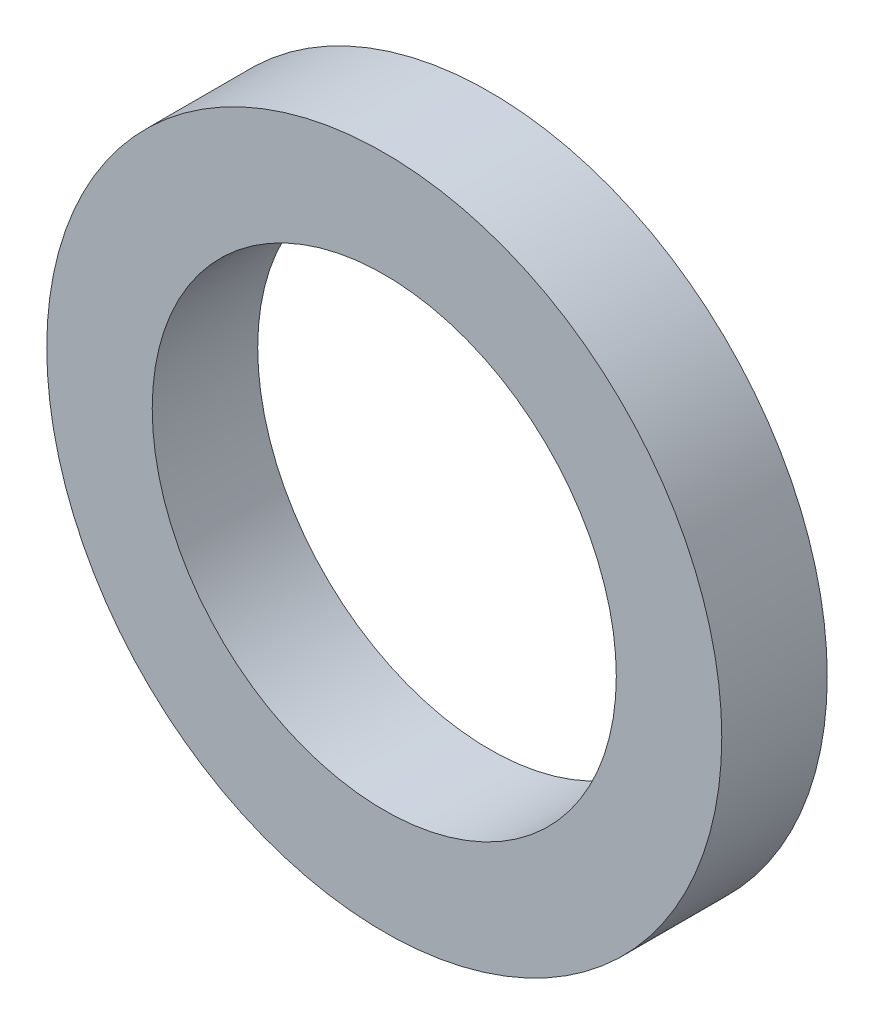
ISO-10303-21;
HEADER;
FILE_DESCRIPTION(('STEP AP214'),'2;1');
FILE_NAME('part.step','',(''),(''),'','','');
FILE_SCHEMA(('AUTOMOTIVE_DESIGN { 1 0 10303 214 1 1 1 1 }'));
ENDSEC;
DATA;
#1=APPLICATION_CONTEXT('core data for automotive mechanical design processes');
#2=APPLICATION_PROTOCOL_DEFINITION('international standard','automotive_design',2000,#1);
#3=PRODUCT_CONTEXT('',#1,'mechanical');
#4=PRODUCT('Part','Part','',(#3));
#5=PRODUCT_RELATED_PRODUCT_CATEGORY('part','',(#4));
#6=PRODUCT_DEFINITION_FORMATION('','',#4);
#7=PRODUCT_DEFINITION_CONTEXT('part definition',#1,'design');
#8=PRODUCT_DEFINITION('design','',#6,#7);
#9=PRODUCT_DEFINITION_SHAPE('','',#8);
#10=(LENGTH_UNIT() NAMED_UNIT(*) SI_UNIT(.MILLI.,.METRE.));
#11=(NAMED_UNIT(*) PLANE_ANGLE_UNIT() SI_UNIT($,.RADIAN.));
#12=(NAMED_UNIT(*) SI_UNIT($,.STERADIAN.) SOLID_ANGLE_UNIT());
#13=UNCERTAINTY_MEASURE_WITH_UNIT(LENGTH_MEASURE(1.E-05),#10,'distance_accuracy_value','');
#14=(GEOMETRIC_REPRESENTATION_CONTEXT(3) GLOBAL_UNCERTAINTY_ASSIGNED_CONTEXT((#13)) GLOBAL_UNIT_ASSIGNED_CONTEXT((#10,
#11,#12)) REPRESENTATION_CONTEXT('',''));
#15=CARTESIAN_POINT('',(0.,0.,0.));
#16=DIRECTION('',(0.,0.,1.));
#17=DIRECTION('',(1.,0.,0.));
#18=AXIS2_PLACEMENT_3D('',#15,#16,#17);
#19=CARTESIAN_POINT('',(0.,0.,2.5));
#20=DIRECTION('',(0.,0.,1.));
#21=DIRECTION('',(1.,0.,0.));
#22=AXIS2_PLACEMENT_3D('',#19,#20,#21);
#23=PLANE('',#22);
#24=CARTESIAN_POINT('',(0.,0.,2.5));
#25=DIRECTION('',(0.,0.,1.));
#26=DIRECTION('',(1.,0.,0.));
#27=AXIS2_PLACEMENT_3D('',#24,#25,#26);
#28=CIRCLE('',#27,8.);
#29=CARTESIAN_POINT('',(8.,0.,2.5));
#30=VERTEX_POINT('',#29);
#31=EDGE_CURVE('E10',#30,#30,#28,.T.);
#32=ORIENTED_EDGE('',*,*,#31,.T.);
#33=EDGE_LOOP('',(#32));
#34=FACE_BOUND('',#33,.T.);
#35=CARTESIAN_POINT('',(0.,0.,2.5));
#36=DIRECTION('',(0.,0.,1.));
#37=DIRECTION('',(1.,0.,0.));
#38=AXIS2_PLACEMENT_3D('',#35,#36,#37);
#39=CIRCLE('',#38,5.5);
#40=CARTESIAN_POINT('',(5.5,0.,2.5));
#41=VERTEX_POINT('',#40);
#42=EDGE_CURVE('E44',#41,#41,#39,.T.);
#43=ORIENTED_EDGE('',*,*,#42,.F.);
#44=EDGE_LOOP('',(#43));
#45=FACE_BOUND('',#44,.T.);
#46=ADVANCED_FACE('F33',(#34,#45),#23,.T.);
#47=CARTESIAN_POINT('',(0.,0.,0.));
#48=DIRECTION('',(0.,0.,1.));
#49=DIRECTION('',(1.,0.,0.));
#50=AXIS2_PLACEMENT_3D('',#47,#48,#49);
#51=PLANE('',#50);
#52=CARTESIAN_POINT('',(0.,0.,0.));
#53=DIRECTION('',(0.,0.,1.));
#54=DIRECTION('',(1.,0.,0.));
#55=AXIS2_PLACEMENT_3D('',#52,#53,#54);
#56=CIRCLE('',#55,8.);
#57=CARTESIAN_POINT('',(8.,0.,0.));
#58=VERTEX_POINT('',#57);
#59=EDGE_CURVE('E37',#58,#58,#56,.T.);
#60=ORIENTED_EDGE('',*,*,#59,.F.);
#61=EDGE_LOOP('',(#60));
#62=FACE_BOUND('',#61,.T.);
#63=CARTESIAN_POINT('',(0.,0.,0.));
#64=DIRECTION('',(0.,0.,1.));
#65=DIRECTION('',(1.,0.,0.));
#66=AXIS2_PLACEMENT_3D('',#63,#64,#65);
#67=CIRCLE('',#66,5.5);
#68=CARTESIAN_POINT('',(5.5,0.,0.));
#69=VERTEX_POINT('',#68);
#70=EDGE_CURVE('E46',#69,#69,#67,.T.);
#71=ORIENTED_EDGE('',*,*,#70,.T.);
#72=EDGE_LOOP('',(#71));
#73=FACE_BOUND('',#72,.T.);
#74=ADVANCED_FACE('F56',(#62,#73),#51,.F.);
#75=CARTESIAN_POINT('',(0.,0.,2.5));
#76=DIRECTION('',(0.,0.,-1.));
#77=DIRECTION('',(-1.,0.,0.));
#78=AXIS2_PLACEMENT_3D('',#75,#76,#77);
#79=CYLINDRICAL_SURFACE('',#78,8.);
#80=ORIENTED_EDGE('',*,*,#31,.F.);
#81=EDGE_LOOP('',(#80));
#82=FACE_BOUND('',#81,.T.);
#83=ORIENTED_EDGE('',*,*,#59,.T.);
#84=EDGE_LOOP('',(#83));
#85=FACE_BOUND('',#84,.T.);
#86=ADVANCED_FACE('F35',(#82,#85),#79,.T.);
#87=CARTESIAN_POINT('',(0.,0.,2.5));
#88=DIRECTION('',(0.,0.,-1.));
#89=DIRECTION('',(-1.,0.,0.));
#90=AXIS2_PLACEMENT_3D('',#87,#88,#89);
#91=CYLINDRICAL_SURFACE('',#90,5.5);
#92=ORIENTED_EDGE('',*,*,#42,.T.);
#93=EDGE_LOOP('',(#92));
#94=FACE_BOUND('',#93,.T.);
#95=ORIENTED_EDGE('',*,*,#70,.F.);
#96=EDGE_LOOP('',(#95));
#97=FACE_BOUND('',#96,.T.);
#98=ADVANCED_FACE('F52',(#94,#97),#91,.F.);
#99=CLOSED_SHELL('',(#46,#74,#86,#98));
#100=MANIFOLD_SOLID_BREP('B2',#99);
#101=ADVANCED_BREP_SHAPE_REPRESENTATION('',(#18,#100),#14);
#102=SHAPE_DEFINITION_REPRESENTATION(#9,#101);
ENDSEC;
END-ISO-10303-21;
